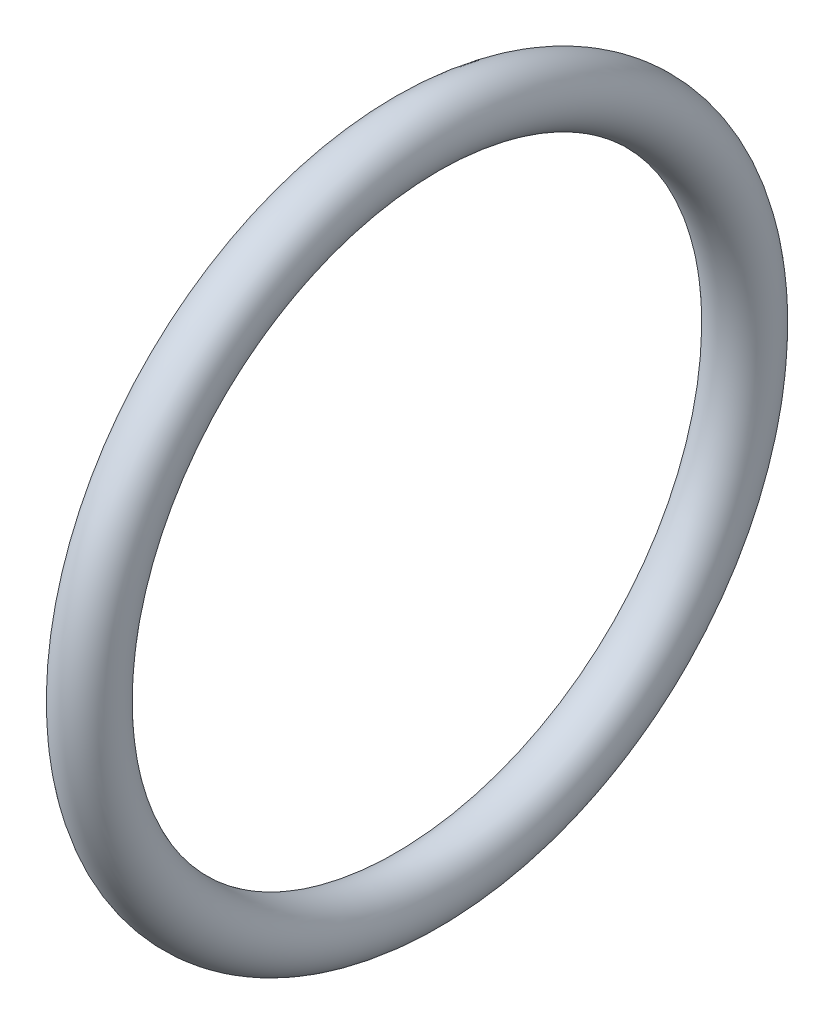
ISO-10303-21;
HEADER;
FILE_DESCRIPTION(('STEP AP214'),'2;1');
FILE_NAME('part.step','',(''),(''),'','','');
FILE_SCHEMA(('AUTOMOTIVE_DESIGN { 1 0 10303 214 1 1 1 1 }'));
ENDSEC;
DATA;
#1=APPLICATION_CONTEXT('core data for automotive mechanical design processes');
#2=APPLICATION_PROTOCOL_DEFINITION('international standard','automotive_design',2000,#1);
#3=PRODUCT_CONTEXT('',#1,'mechanical');
#4=PRODUCT('Part','Part','',(#3));
#5=PRODUCT_RELATED_PRODUCT_CATEGORY('part','',(#4));
#6=PRODUCT_DEFINITION_FORMATION('','',#4);
#7=PRODUCT_DEFINITION_CONTEXT('part definition',#1,'design');
#8=PRODUCT_DEFINITION('design','',#6,#7);
#9=PRODUCT_DEFINITION_SHAPE('','',#8);
#10=(LENGTH_UNIT() NAMED_UNIT(*) SI_UNIT(.MILLI.,.METRE.));
#11=(NAMED_UNIT(*) PLANE_ANGLE_UNIT() SI_UNIT($,.RADIAN.));
#12=(NAMED_UNIT(*) SI_UNIT($,.STERADIAN.) SOLID_ANGLE_UNIT());
#13=UNCERTAINTY_MEASURE_WITH_UNIT(LENGTH_MEASURE(1.E-05),#10,'distance_accuracy_value','');
#14=(GEOMETRIC_REPRESENTATION_CONTEXT(3) GLOBAL_UNCERTAINTY_ASSIGNED_CONTEXT((#13)) GLOBAL_UNIT_ASSIGNED_CONTEXT((#10,
#11,#12)) REPRESENTATION_CONTEXT('',''));
#15=CARTESIAN_POINT('',(0.,0.,0.));
#16=DIRECTION('',(0.,0.,1.));
#17=DIRECTION('',(1.,0.,0.));
#18=AXIS2_PLACEMENT_3D('',#15,#16,#17);
#19=CARTESIAN_POINT('',(-1.22737432677997,5.55631753608634,0.));
#20=DIRECTION('',(-1.,0.,0.));
#21=DIRECTION('',(0.,0.,1.));
#22=AXIS2_PLACEMENT_3D('',#19,#20,#21);
#23=PLANE('',#22);
#24=CARTESIAN_POINT('',(-1.22737432677996,-13.4682824639137,0.));
#25=DIRECTION('',(1.,0.,0.));
#26=DIRECTION('',(0.,1.,0.));
#27=AXIS2_PLACEMENT_3D('',#24,#25,#26);
#28=CIRCLE('',#27,17.7984743579877);
#29=CARTESIAN_POINT('',(-1.22737432677997,4.33019189407404,0.));
#30=VERTEX_POINT('',#29);
#31=EDGE_CURVE('E10',#30,#30,#28,.F.);
#32=ORIENTED_EDGE('',*,*,#31,.F.);
#33=EDGE_LOOP('',(#32));
#34=FACE_BOUND('',#33,.T.);
#35=CARTESIAN_POINT('',(-1.22737432677996,-13.4682824639137,0.));
#36=DIRECTION('',(1.,0.,0.));
#37=DIRECTION('',(0.,1.,0.));
#38=AXIS2_PLACEMENT_3D('',#35,#36,#37);
#39=CIRCLE('',#38,20.2507256420123);
#40=CARTESIAN_POINT('',(-1.22737432677997,6.78244317809864,0.));
#41=VERTEX_POINT('',#40);
#42=EDGE_CURVE('E18',#41,#41,#39,.T.);
#43=ORIENTED_EDGE('',*,*,#42,.F.);
#44=EDGE_LOOP('',(#43));
#45=FACE_BOUND('',#44,.T.);
#46=ADVANCED_FACE('F15',(#34,#45),#23,.T.);
#47=CARTESIAN_POINT('',(0.0426256732200096,-13.4682824639137,0.));
#48=DIRECTION('',(1.,0.,0.));
#49=DIRECTION('',(0.,0.,-1.));
#50=AXIS2_PLACEMENT_3D('',#47,#48,#49);
#51=TOROIDAL_SURFACE('',#50,19.0246,1.7653);
#52=ORIENTED_EDGE('',*,*,#42,.T.);
#53=EDGE_LOOP('',(#52));
#54=FACE_BOUND('',#53,.T.);
#55=ORIENTED_EDGE('',*,*,#31,.T.);
#56=EDGE_LOOP('',(#55));
#57=FACE_BOUND('',#56,.T.);
#58=ADVANCED_FACE('F27',(#54,#57),#51,.T.);
#59=CLOSED_SHELL('',(#46,#58));
#60=MANIFOLD_SOLID_BREP('B1',#59);
#61=ADVANCED_BREP_SHAPE_REPRESENTATION('',(#18,#60),#14);
#62=SHAPE_DEFINITION_REPRESENTATION(#9,#61);
ENDSEC;
END-ISO-10303-21;
